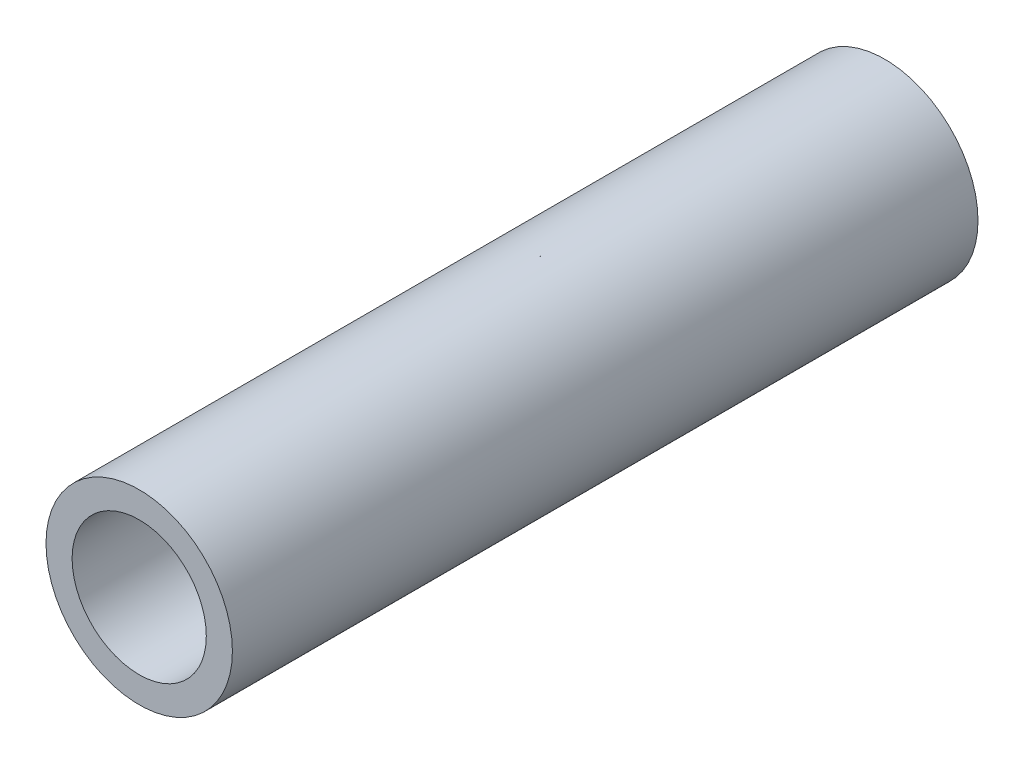
ISO-10303-21;
HEADER;
FILE_DESCRIPTION(('STEP AP214'),'2;1');
FILE_NAME('part.step','',(''),(''),'','','');
FILE_SCHEMA(('AUTOMOTIVE_DESIGN { 1 0 10303 214 1 1 1 1 }'));
ENDSEC;
DATA;
#1=APPLICATION_CONTEXT('core data for automotive mechanical design processes');
#2=APPLICATION_PROTOCOL_DEFINITION('international standard','automotive_design',2000,#1);
#3=PRODUCT_CONTEXT('',#1,'mechanical');
#4=PRODUCT('Part','Part','',(#3));
#5=PRODUCT_RELATED_PRODUCT_CATEGORY('part','',(#4));
#6=PRODUCT_DEFINITION_FORMATION('','',#4);
#7=PRODUCT_DEFINITION_CONTEXT('part definition',#1,'design');
#8=PRODUCT_DEFINITION('design','',#6,#7);
#9=PRODUCT_DEFINITION_SHAPE('','',#8);
#10=(LENGTH_UNIT() NAMED_UNIT(*) SI_UNIT(.MILLI.,.METRE.));
#11=(NAMED_UNIT(*) PLANE_ANGLE_UNIT() SI_UNIT($,.RADIAN.));
#12=(NAMED_UNIT(*) SI_UNIT($,.STERADIAN.) SOLID_ANGLE_UNIT());
#13=UNCERTAINTY_MEASURE_WITH_UNIT(LENGTH_MEASURE(1.E-05),#10,'distance_accuracy_value','');
#14=(GEOMETRIC_REPRESENTATION_CONTEXT(3) GLOBAL_UNCERTAINTY_ASSIGNED_CONTEXT((#13)) GLOBAL_UNIT_ASSIGNED_CONTEXT((#10,
#11,#12)) REPRESENTATION_CONTEXT('',''));
#15=CARTESIAN_POINT('',(0.,0.,0.));
#16=DIRECTION('',(0.,0.,1.));
#17=DIRECTION('',(1.,0.,0.));
#18=AXIS2_PLACEMENT_3D('',#15,#16,#17);
#19=CARTESIAN_POINT('',(0.,0.,20.));
#20=DIRECTION('',(0.,0.,-1.));
#21=DIRECTION('',(-1.,0.,0.));
#22=AXIS2_PLACEMENT_3D('',#19,#20,#21);
#23=CYLINDRICAL_SURFACE('',#22,1.8);
#24=CARTESIAN_POINT('',(0.,0.,20.));
#25=DIRECTION('',(0.,0.,1.));
#26=DIRECTION('',(1.,0.,0.));
#27=AXIS2_PLACEMENT_3D('',#24,#25,#26);
#28=CIRCLE('',#27,1.8);
#29=CARTESIAN_POINT('',(1.8,0.,20.));
#30=VERTEX_POINT('',#29);
#31=EDGE_CURVE('E58',#30,#30,#28,.T.);
#32=ORIENTED_EDGE('',*,*,#31,.T.);
#33=EDGE_LOOP('',(#32));
#34=FACE_BOUND('',#33,.T.);
#35=CARTESIAN_POINT('',(0.,0.,3.15));
#36=DIRECTION('',(0.,0.,-1.));
#37=DIRECTION('',(-1.,0.,0.));
#38=AXIS2_PLACEMENT_3D('',#35,#36,#37);
#39=CIRCLE('',#38,1.8);
#40=CARTESIAN_POINT('',(-1.8,0.,3.15));
#41=VERTEX_POINT('',#40);
#42=EDGE_CURVE('E63',#41,#41,#39,.T.);
#43=ORIENTED_EDGE('',*,*,#42,.T.);
#44=EDGE_LOOP('',(#43));
#45=FACE_BOUND('',#44,.T.);
#46=ADVANCED_FACE('F43',(#34,#45),#23,.F.);
#47=CARTESIAN_POINT('',(0.,0.,20.));
#48=DIRECTION('',(0.,0.,1.));
#49=DIRECTION('',(1.,0.,0.));
#50=AXIS2_PLACEMENT_3D('',#47,#48,#49);
#51=PLANE('',#50);
#52=CARTESIAN_POINT('',(0.,0.,20.));
#53=DIRECTION('',(0.,0.,1.));
#54=DIRECTION('',(1.,0.,0.));
#55=AXIS2_PLACEMENT_3D('',#52,#53,#54);
#56=CIRCLE('',#55,2.5);
#57=CARTESIAN_POINT('',(2.5,0.,20.));
#58=VERTEX_POINT('',#57);
#59=EDGE_CURVE('E10',#58,#58,#56,.T.);
#60=ORIENTED_EDGE('',*,*,#59,.T.);
#61=EDGE_LOOP('',(#60));
#62=FACE_BOUND('',#61,.T.);
#63=ORIENTED_EDGE('',*,*,#31,.F.);
#64=EDGE_LOOP('',(#63));
#65=FACE_BOUND('',#64,.T.);
#66=ADVANCED_FACE('F88',(#62,#65),#51,.T.);
#67=CARTESIAN_POINT('',(0.,0.,0.));
#68=DIRECTION('',(0.,0.,1.));
#69=DIRECTION('',(1.,0.,0.));
#70=AXIS2_PLACEMENT_3D('',#67,#68,#69);
#71=PLANE('',#70);
#72=CARTESIAN_POINT('',(0.,0.,0.));
#73=DIRECTION('',(0.,0.,1.));
#74=DIRECTION('',(1.,0.,0.));
#75=AXIS2_PLACEMENT_3D('',#72,#73,#74);
#76=CIRCLE('',#75,1.12);
#77=CARTESIAN_POINT('',(1.12,0.,0.));
#78=VERTEX_POINT('',#77);
#79=EDGE_CURVE('E67',#78,#78,#76,.T.);
#80=ORIENTED_EDGE('',*,*,#79,.T.);
#81=EDGE_LOOP('',(#80));
#82=FACE_BOUND('',#81,.T.);
#83=CARTESIAN_POINT('',(0.,0.,0.));
#84=DIRECTION('',(0.,0.,1.));
#85=DIRECTION('',(1.,0.,0.));
#86=AXIS2_PLACEMENT_3D('',#83,#84,#85);
#87=CIRCLE('',#86,2.5);
#88=CARTESIAN_POINT('',(2.5,0.,0.));
#89=VERTEX_POINT('',#88);
#90=EDGE_CURVE('E52',#89,#89,#87,.T.);
#91=ORIENTED_EDGE('',*,*,#90,.F.);
#92=EDGE_LOOP('',(#91));
#93=FACE_BOUND('',#92,.T.);
#94=ADVANCED_FACE('F96',(#82,#93),#71,.F.);
#95=CARTESIAN_POINT('',(0.,0.,20.));
#96=DIRECTION('',(0.,0.,-1.));
#97=DIRECTION('',(-1.,0.,0.));
#98=AXIS2_PLACEMENT_3D('',#95,#96,#97);
#99=CYLINDRICAL_SURFACE('',#98,2.5);
#100=ORIENTED_EDGE('',*,*,#59,.F.);
#101=EDGE_LOOP('',(#100));
#102=FACE_BOUND('',#101,.T.);
#103=ORIENTED_EDGE('',*,*,#90,.T.);
#104=EDGE_LOOP('',(#103));
#105=FACE_BOUND('',#104,.T.);
#106=ADVANCED_FACE('F45',(#102,#105),#99,.T.);
#107=CARTESIAN_POINT('',(0.,0.,3.15));
#108=DIRECTION('',(0.,0.,-1.));
#109=DIRECTION('',(-1.,0.,0.));
#110=AXIS2_PLACEMENT_3D('',#107,#108,#109);
#111=PLANE('',#110);
#112=CARTESIAN_POINT('',(0.,0.,3.15));
#113=DIRECTION('',(0.,0.,-1.));
#114=DIRECTION('',(-1.,0.,0.));
#115=AXIS2_PLACEMENT_3D('',#112,#113,#114);
#116=CIRCLE('',#115,1.12);
#117=CARTESIAN_POINT('',(-1.12,0.,3.15));
#118=VERTEX_POINT('',#117);
#119=EDGE_CURVE('E47',#118,#118,#116,.T.);
#120=ORIENTED_EDGE('',*,*,#119,.T.);
#121=EDGE_LOOP('',(#120));
#122=FACE_BOUND('',#121,.T.);
#123=ORIENTED_EDGE('',*,*,#42,.F.);
#124=EDGE_LOOP('',(#123));
#125=FACE_BOUND('',#124,.T.);
#126=ADVANCED_FACE('F76',(#122,#125),#111,.F.);
#127=CARTESIAN_POINT('',(0.,0.,20.));
#128=DIRECTION('',(0.,0.,-1.));
#129=DIRECTION('',(-1.,0.,0.));
#130=AXIS2_PLACEMENT_3D('',#127,#128,#129);
#131=CYLINDRICAL_SURFACE('',#130,1.12);
#132=ORIENTED_EDGE('',*,*,#119,.F.);
#133=EDGE_LOOP('',(#132));
#134=FACE_BOUND('',#133,.T.);
#135=ORIENTED_EDGE('',*,*,#79,.F.);
#136=EDGE_LOOP('',(#135));
#137=FACE_BOUND('',#136,.T.);
#138=ADVANCED_FACE('F79',(#134,#137),#131,.F.);
#139=CLOSED_SHELL('',(#46,#66,#94,#106,#126,#138));
#140=MANIFOLD_SOLID_BREP('B2',#139);
#141=ADVANCED_BREP_SHAPE_REPRESENTATION('',(#18,#140),#14);
#142=SHAPE_DEFINITION_REPRESENTATION(#9,#141);
ENDSEC;
END-ISO-10303-21;
